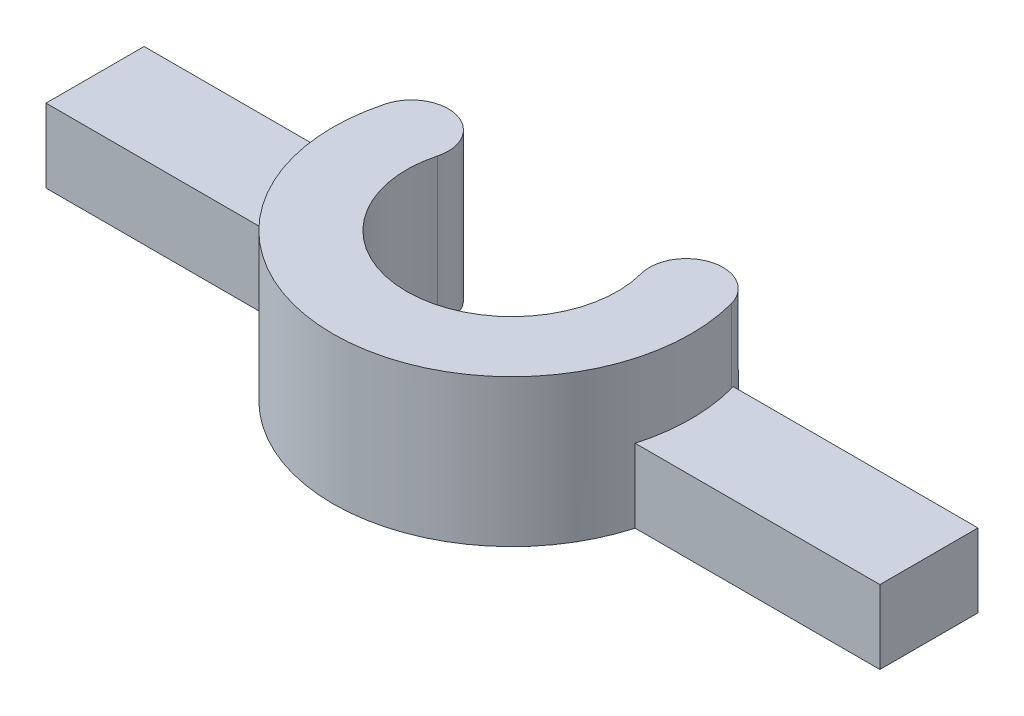
ISO-10303-21;
HEADER;
FILE_DESCRIPTION(('STEP AP214'),'2;1');
FILE_NAME('part.step','',(''),(''),'','','');
FILE_SCHEMA(('AUTOMOTIVE_DESIGN { 1 0 10303 214 1 1 1 1 }'));
ENDSEC;
DATA;
#1=APPLICATION_CONTEXT('core data for automotive mechanical design processes');
#2=APPLICATION_PROTOCOL_DEFINITION('international standard','automotive_design',2000,#1);
#3=PRODUCT_CONTEXT('',#1,'mechanical');
#4=PRODUCT('Part','Part','',(#3));
#5=PRODUCT_RELATED_PRODUCT_CATEGORY('part','',(#4));
#6=PRODUCT_DEFINITION_FORMATION('','',#4);
#7=PRODUCT_DEFINITION_CONTEXT('part definition',#1,'design');
#8=PRODUCT_DEFINITION('design','',#6,#7);
#9=PRODUCT_DEFINITION_SHAPE('','',#8);
#10=(LENGTH_UNIT() NAMED_UNIT(*) SI_UNIT(.MILLI.,.METRE.));
#11=(NAMED_UNIT(*) PLANE_ANGLE_UNIT() SI_UNIT($,.RADIAN.));
#12=(NAMED_UNIT(*) SI_UNIT($,.STERADIAN.) SOLID_ANGLE_UNIT());
#13=UNCERTAINTY_MEASURE_WITH_UNIT(LENGTH_MEASURE(1.E-05),#10,'distance_accuracy_value','');
#14=(GEOMETRIC_REPRESENTATION_CONTEXT(3) GLOBAL_UNCERTAINTY_ASSIGNED_CONTEXT((#13)) GLOBAL_UNIT_ASSIGNED_CONTEXT((#10,
#11,#12)) REPRESENTATION_CONTEXT('',''));
#15=CARTESIAN_POINT('',(0.,0.,0.));
#16=DIRECTION('',(0.,0.,1.));
#17=DIRECTION('',(1.,0.,0.));
#18=AXIS2_PLACEMENT_3D('',#15,#16,#17);
#19=CARTESIAN_POINT('',(0.,68.,0.));
#20=DIRECTION('',(0.,-1.,0.));
#21=DIRECTION('',(0.,0.,-1.));
#22=AXIS2_PLACEMENT_3D('',#19,#20,#21);
#23=CYLINDRICAL_SURFACE('',#22,7.3);
#24=CARTESIAN_POINT('',(0.,62.,0.));
#25=DIRECTION('',(0.,-1.,0.));
#26=DIRECTION('',(0.,0.,-1.));
#27=AXIS2_PLACEMENT_3D('',#24,#25,#26);
#28=CIRCLE('',#27,7.3);
#29=CARTESIAN_POINT('',(7.0206837273873,62.,2.));
#30=VERTEX_POINT('',#29);
#31=CARTESIAN_POINT('',(-7.02068372738718,62.,2.));
#32=VERTEX_POINT('',#31);
#33=EDGE_CURVE('E186',#30,#32,#28,.T.);
#34=ORIENTED_EDGE('',*,*,#33,.F.);
#35=DIRECTION('',(0.,-1.,0.));
#36=VECTOR('',#35,1.);
#37=CARTESIAN_POINT('',(7.0206837273873,68.,2.));
#38=LINE('',#37,#36);
#39=CARTESIAN_POINT('',(7.0206837273873,65.,2.));
#40=VERTEX_POINT('',#39);
#41=EDGE_CURVE('E148',#40,#30,#38,.T.);
#42=ORIENTED_EDGE('',*,*,#41,.F.);
#43=CARTESIAN_POINT('',(0.,65.,0.));
#44=DIRECTION('',(0.,-1.,0.));
#45=DIRECTION('',(1.,0.,0.));
#46=AXIS2_PLACEMENT_3D('',#43,#44,#45);
#47=CIRCLE('',#46,7.3);
#48=CARTESIAN_POINT('',(7.05087040488933,65.,-1.89082694434383));
#49=VERTEX_POINT('',#48);
#50=EDGE_CURVE('E200',#40,#49,#47,.F.);
#51=ORIENTED_EDGE('',*,*,#50,.T.);
#52=DIRECTION('',(0.,-1.,0.));
#53=VECTOR('',#52,1.);
#54=CARTESIAN_POINT('',(7.05087040488933,68.,-1.89082694434383));
#55=LINE('',#54,#53);
#56=CARTESIAN_POINT('',(7.05087040488933,68.,-1.89082694434383));
#57=VERTEX_POINT('',#56);
#58=EDGE_CURVE('E216',#49,#57,#55,.F.);
#59=ORIENTED_EDGE('',*,*,#58,.T.);
#60=CARTESIAN_POINT('',(0.,68.,0.));
#61=DIRECTION('',(0.,1.,0.));
#62=DIRECTION('',(0.,0.,1.));
#63=AXIS2_PLACEMENT_3D('',#60,#61,#62);
#64=CIRCLE('',#63,7.3);
#65=CARTESIAN_POINT('',(-7.05087040488921,68.,-1.89082694434383));
#66=VERTEX_POINT('',#65);
#67=EDGE_CURVE('E197',#66,#57,#64,.T.);
#68=ORIENTED_EDGE('',*,*,#67,.F.);
#69=DIRECTION('',(0.,-1.,0.));
#70=VECTOR('',#69,1.);
#71=CARTESIAN_POINT('',(-7.05087040488921,68.,-1.89082694434383));
#72=LINE('',#71,#70);
#73=CARTESIAN_POINT('',(-7.05087040488921,65.,-1.89082694434383));
#74=VERTEX_POINT('',#73);
#75=EDGE_CURVE('E241',#66,#74,#72,.T.);
#76=ORIENTED_EDGE('',*,*,#75,.T.);
#77=CARTESIAN_POINT('',(-7.02068372738718,65.,2.));
#78=VERTEX_POINT('',#77);
#79=EDGE_CURVE('E203',#74,#78,#47,.F.);
#80=ORIENTED_EDGE('',*,*,#79,.T.);
#81=DIRECTION('',(0.,-1.,0.));
#82=VECTOR('',#81,1.);
#83=CARTESIAN_POINT('',(-7.02068372738718,68.,2.));
#84=LINE('',#83,#82);
#85=EDGE_CURVE('E213',#32,#78,#84,.F.);
#86=ORIENTED_EDGE('',*,*,#85,.F.);
#87=EDGE_LOOP('',(#34,#42,#51,#59,#68,#76,#80,#86));
#88=FACE_BOUND('',#87,.T.);
#89=ADVANCED_FACE('F40',(#88),#23,.T.);
#90=CARTESIAN_POINT('',(0.,68.,0.));
#91=DIRECTION('',(0.,-1.,0.));
#92=DIRECTION('',(0.,0.,-1.));
#93=AXIS2_PLACEMENT_3D('',#90,#91,#92);
#94=CYLINDRICAL_SURFACE('',#93,4.3);
#95=DIRECTION('',(0.,-1.,0.));
#96=VECTOR('',#95,1.);
#97=CARTESIAN_POINT('',(4.1532524302773,68.,-1.1137747754354));
#98=LINE('',#97,#96);
#99=CARTESIAN_POINT('',(4.1532524302773,68.,-1.1137747754354));
#100=VERTEX_POINT('',#99);
#101=CARTESIAN_POINT('',(4.1532524302773,62.,-1.1137747754354));
#102=VERTEX_POINT('',#101);
#103=EDGE_CURVE('E225',#100,#102,#98,.T.);
#104=ORIENTED_EDGE('',*,*,#103,.T.);
#105=CARTESIAN_POINT('',(0.,62.,0.));
#106=DIRECTION('',(0.,-1.,0.));
#107=DIRECTION('',(0.,0.,-1.));
#108=AXIS2_PLACEMENT_3D('',#105,#106,#107);
#109=CIRCLE('',#108,4.3);
#110=CARTESIAN_POINT('',(-4.15325243027718,62.,-1.1137747754354));
#111=VERTEX_POINT('',#110);
#112=EDGE_CURVE('E183',#102,#111,#109,.T.);
#113=ORIENTED_EDGE('',*,*,#112,.T.);
#114=DIRECTION('',(0.,-1.,0.));
#115=VECTOR('',#114,1.);
#116=CARTESIAN_POINT('',(-4.15325243027718,68.,-1.1137747754354));
#117=LINE('',#116,#115);
#118=CARTESIAN_POINT('',(-4.15325243027718,68.,-1.1137747754354));
#119=VERTEX_POINT('',#118);
#120=EDGE_CURVE('E233',#111,#119,#117,.F.);
#121=ORIENTED_EDGE('',*,*,#120,.T.);
#122=CARTESIAN_POINT('',(0.,68.,0.));
#123=DIRECTION('',(0.,1.,0.));
#124=DIRECTION('',(0.,0.,1.));
#125=AXIS2_PLACEMENT_3D('',#122,#123,#124);
#126=CIRCLE('',#125,4.3);
#127=EDGE_CURVE('E195',#119,#100,#126,.T.);
#128=ORIENTED_EDGE('',*,*,#127,.T.);
#129=EDGE_LOOP('',(#104,#113,#121,#128));
#130=FACE_BOUND('',#129,.T.);
#131=ADVANCED_FACE('F280',(#130),#94,.F.);
#132=CARTESIAN_POINT('',(0.,0.,-2.));
#133=DIRECTION('',(0.,0.,1.));
#134=DIRECTION('',(1.,0.,0.));
#135=AXIS2_PLACEMENT_3D('',#132,#133,#134);
#136=PLANE('',#135);
#137=DIRECTION('',(1.,0.,0.));
#138=VECTOR('',#137,1.);
#139=CARTESIAN_POINT('',(0.,62.,-2.));
#140=LINE('',#139,#138);
#141=CARTESIAN_POINT('',(-17.,62.,-2.));
#142=VERTEX_POINT('',#141);
#143=CARTESIAN_POINT('',(-7.01708635232229,62.,-2.));
#144=VERTEX_POINT('',#143);
#145=EDGE_CURVE('E210',#142,#144,#140,.T.);
#146=ORIENTED_EDGE('',*,*,#145,.F.);
#147=DIRECTION('',(0.,-1.,0.));
#148=VECTOR('',#147,1.);
#149=CARTESIAN_POINT('',(-17.,65.,-2.));
#150=LINE('',#149,#148);
#151=CARTESIAN_POINT('',(-17.,65.,-2.));
#152=VERTEX_POINT('',#151);
#153=EDGE_CURVE('E176',#152,#142,#150,.T.);
#154=ORIENTED_EDGE('',*,*,#153,.F.);
#155=DIRECTION('',(1.,0.,0.));
#156=VECTOR('',#155,1.);
#157=CARTESIAN_POINT('',(0.,65.,-2.));
#158=LINE('',#157,#156);
#159=CARTESIAN_POINT('',(-7.01708635232229,65.,-2.));
#160=VERTEX_POINT('',#159);
#161=EDGE_CURVE('E62',#152,#160,#158,.T.);
#162=ORIENTED_EDGE('',*,*,#161,.T.);
#163=DIRECTION('',(0.,-1.,0.));
#164=VECTOR('',#163,1.);
#165=CARTESIAN_POINT('',(-7.01708635232229,65.,-2.));
#166=LINE('',#165,#164);
#167=EDGE_CURVE('E48',#160,#144,#166,.T.);
#168=ORIENTED_EDGE('',*,*,#167,.T.);
#169=EDGE_LOOP('',(#146,#154,#162,#168));
#170=FACE_BOUND('',#169,.T.);
#171=ADVANCED_FACE('F285',(#170),#136,.F.);
#172=CARTESIAN_POINT('',(7.01708635232241,65.,-2.));
#173=VERTEX_POINT('',#172);
#174=CARTESIAN_POINT('',(17.,65.,-2.));
#175=VERTEX_POINT('',#174);
#176=EDGE_CURVE('E208',#173,#175,#158,.T.);
#177=ORIENTED_EDGE('',*,*,#176,.T.);
#178=DIRECTION('',(0.,-1.,0.));
#179=VECTOR('',#178,1.);
#180=CARTESIAN_POINT('',(17.,65.,-2.));
#181=LINE('',#180,#179);
#182=CARTESIAN_POINT('',(17.,62.,-2.));
#183=VERTEX_POINT('',#182);
#184=EDGE_CURVE('E165',#175,#183,#181,.T.);
#185=ORIENTED_EDGE('',*,*,#184,.T.);
#186=CARTESIAN_POINT('',(7.01708635232241,62.,-2.));
#187=VERTEX_POINT('',#186);
#188=EDGE_CURVE('E164',#187,#183,#140,.T.);
#189=ORIENTED_EDGE('',*,*,#188,.F.);
#190=DIRECTION('',(0.,-1.,0.));
#191=VECTOR('',#190,1.);
#192=CARTESIAN_POINT('',(7.01708635232241,62.,-2.));
#193=LINE('',#192,#191);
#194=EDGE_CURVE('E228',#187,#173,#193,.F.);
#195=ORIENTED_EDGE('',*,*,#194,.T.);
#196=EDGE_LOOP('',(#177,#185,#189,#195));
#197=FACE_BOUND('',#196,.T.);
#198=ADVANCED_FACE('F282',(#197),#136,.F.);
#199=CARTESIAN_POINT('',(0.,0.,2.));
#200=DIRECTION('',(0.,0.,1.));
#201=DIRECTION('',(1.,0.,0.));
#202=AXIS2_PLACEMENT_3D('',#199,#200,#201);
#203=PLANE('',#202);
#204=DIRECTION('',(1.,0.,0.));
#205=VECTOR('',#204,1.);
#206=CARTESIAN_POINT('',(0.,65.,2.));
#207=LINE('',#206,#205);
#208=CARTESIAN_POINT('',(-17.,65.,2.));
#209=VERTEX_POINT('',#208);
#210=EDGE_CURVE('E151',#209,#78,#207,.T.);
#211=ORIENTED_EDGE('',*,*,#210,.F.);
#212=DIRECTION('',(0.,1.,0.));
#213=VECTOR('',#212,1.);
#214=CARTESIAN_POINT('',(-17.,65.,2.));
#215=LINE('',#214,#213);
#216=CARTESIAN_POINT('',(-17.,62.,2.));
#217=VERTEX_POINT('',#216);
#218=EDGE_CURVE('E170',#217,#209,#215,.T.);
#219=ORIENTED_EDGE('',*,*,#218,.F.);
#220=DIRECTION('',(1.,0.,0.));
#221=VECTOR('',#220,1.);
#222=CARTESIAN_POINT('',(0.,62.,2.));
#223=LINE('',#222,#221);
#224=EDGE_CURVE('E150',#217,#32,#223,.T.);
#225=ORIENTED_EDGE('',*,*,#224,.T.);
#226=ORIENTED_EDGE('',*,*,#85,.T.);
#227=EDGE_LOOP('',(#211,#219,#225,#226));
#228=FACE_BOUND('',#227,.T.);
#229=ADVANCED_FACE('F284',(#228),#203,.T.);
#230=CARTESIAN_POINT('',(17.,62.,2.));
#231=VERTEX_POINT('',#230);
#232=EDGE_CURVE('E142',#30,#231,#223,.T.);
#233=ORIENTED_EDGE('',*,*,#232,.T.);
#234=DIRECTION('',(0.,1.,0.));
#235=VECTOR('',#234,1.);
#236=CARTESIAN_POINT('',(17.,65.,2.));
#237=LINE('',#236,#235);
#238=CARTESIAN_POINT('',(17.,65.,2.));
#239=VERTEX_POINT('',#238);
#240=EDGE_CURVE('E146',#231,#239,#237,.T.);
#241=ORIENTED_EDGE('',*,*,#240,.T.);
#242=EDGE_CURVE('E205',#40,#239,#207,.T.);
#243=ORIENTED_EDGE('',*,*,#242,.F.);
#244=ORIENTED_EDGE('',*,*,#41,.T.);
#245=EDGE_LOOP('',(#233,#241,#243,#244));
#246=FACE_BOUND('',#245,.T.);
#247=ADVANCED_FACE('F144',(#246),#203,.T.);
#248=CARTESIAN_POINT('',(5.60206141758332,68.,-1.50230085988962));
#249=DIRECTION('',(0.,-1.,0.));
#250=DIRECTION('',(0.,0.,-1.));
#251=AXIS2_PLACEMENT_3D('',#248,#249,#250);
#252=CYLINDRICAL_SURFACE('',#251,1.5);
#253=DIRECTION('',(0.,1.,0.));
#254=VECTOR('',#253,1.);
#255=CARTESIAN_POINT('',(4.85206141758332,68.,-2.80133896556628));
#256=LINE('',#255,#254);
#257=CARTESIAN_POINT('',(4.85206141758332,62.,-2.80133896556628));
#258=VERTEX_POINT('',#257);
#259=CARTESIAN_POINT('',(4.85206141758332,68.,-2.80133896556627));
#260=VERTEX_POINT('',#259);
#261=EDGE_CURVE('E198',#258,#260,#256,.T.);
#262=ORIENTED_EDGE('',*,*,#261,.F.);
#263=CARTESIAN_POINT('',(5.60206141758332,62.,-1.50230085988962));
#264=DIRECTION('',(0.,-1.,0.));
#265=DIRECTION('',(0.,0.,-1.));
#266=AXIS2_PLACEMENT_3D('',#263,#264,#265);
#267=CIRCLE('',#266,1.5);
#268=EDGE_CURVE('E188',#258,#102,#267,.F.);
#269=ORIENTED_EDGE('',*,*,#268,.T.);
#270=ORIENTED_EDGE('',*,*,#103,.F.);
#271=CARTESIAN_POINT('',(5.60206141758332,68.,-1.50230085988962));
#272=DIRECTION('',(0.,1.,0.));
#273=DIRECTION('',(0.,0.,1.));
#274=AXIS2_PLACEMENT_3D('',#271,#272,#273);
#275=CIRCLE('',#274,1.5);
#276=EDGE_CURVE('E219',#260,#100,#275,.T.);
#277=ORIENTED_EDGE('',*,*,#276,.F.);
#278=EDGE_LOOP('',(#262,#269,#270,#277));
#279=FACE_BOUND('',#278,.T.);
#280=ADVANCED_FACE('F278',(#279),#252,.T.);
#281=CARTESIAN_POINT('',(5.60206141758332,68.,-1.50230085988962));
#282=DIRECTION('',(0.,-1.,0.));
#283=DIRECTION('',(0.,0.,-1.));
#284=AXIS2_PLACEMENT_3D('',#281,#282,#283);
#285=CYLINDRICAL_SURFACE('',#284,1.5);
#286=ORIENTED_EDGE('',*,*,#194,.F.);
#287=CARTESIAN_POINT('',(5.60206141758332,62.,-1.50230085988962));
#288=DIRECTION('',(0.,-1.,0.));
#289=DIRECTION('',(0.,0.,-1.));
#290=AXIS2_PLACEMENT_3D('',#287,#288,#289);
#291=CIRCLE('',#290,1.5);
#292=EDGE_CURVE('E189',#187,#258,#291,.F.);
#293=ORIENTED_EDGE('',*,*,#292,.T.);
#294=ORIENTED_EDGE('',*,*,#261,.T.);
#295=CARTESIAN_POINT('',(5.60206141758332,68.,-1.50230085988962));
#296=DIRECTION('',(0.,1.,0.));
#297=DIRECTION('',(0.,0.,1.));
#298=AXIS2_PLACEMENT_3D('',#295,#296,#297);
#299=CIRCLE('',#298,1.5);
#300=EDGE_CURVE('E222',#57,#260,#299,.T.);
#301=ORIENTED_EDGE('',*,*,#300,.F.);
#302=ORIENTED_EDGE('',*,*,#58,.F.);
#303=CARTESIAN_POINT('',(5.60206141758332,65.,-1.50230085988962));
#304=DIRECTION('',(0.,-1.,0.));
#305=DIRECTION('',(1.,0.,0.));
#306=AXIS2_PLACEMENT_3D('',#303,#304,#305);
#307=CIRCLE('',#306,1.5);
#308=EDGE_CURVE('E231',#173,#49,#307,.T.);
#309=ORIENTED_EDGE('',*,*,#308,.F.);
#310=EDGE_LOOP('',(#286,#293,#294,#301,#302,#309));
#311=FACE_BOUND('',#310,.T.);
#312=ADVANCED_FACE('F273',(#311),#285,.T.);
#313=CARTESIAN_POINT('',(-5.60206141758319,68.,-1.50230085988962));
#314=DIRECTION('',(0.,-1.,0.));
#315=DIRECTION('',(0.,0.,-1.));
#316=AXIS2_PLACEMENT_3D('',#313,#314,#315);
#317=CYLINDRICAL_SURFACE('',#316,1.5);
#318=DIRECTION('',(0.,1.,0.));
#319=VECTOR('',#318,1.);
#320=CARTESIAN_POINT('',(-4.8520614175832,68.,-2.80133896556627));
#321=LINE('',#320,#319);
#322=CARTESIAN_POINT('',(-4.8520614175832,62.,-2.80133896556627));
#323=VERTEX_POINT('',#322);
#324=CARTESIAN_POINT('',(-4.8520614175832,68.,-2.80133896556627));
#325=VERTEX_POINT('',#324);
#326=EDGE_CURVE('E192',#323,#325,#321,.T.);
#327=ORIENTED_EDGE('',*,*,#326,.F.);
#328=CARTESIAN_POINT('',(-5.60206141758319,62.,-1.50230085988962));
#329=DIRECTION('',(0.,-1.,0.));
#330=DIRECTION('',(0.,0.,-1.));
#331=AXIS2_PLACEMENT_3D('',#328,#329,#330);
#332=CIRCLE('',#331,1.5);
#333=EDGE_CURVE('E55',#323,#144,#332,.F.);
#334=ORIENTED_EDGE('',*,*,#333,.T.);
#335=ORIENTED_EDGE('',*,*,#167,.F.);
#336=CARTESIAN_POINT('',(-5.60206141758319,65.,-1.50230085988962));
#337=DIRECTION('',(0.,-1.,0.));
#338=DIRECTION('',(1.,0.,0.));
#339=AXIS2_PLACEMENT_3D('',#336,#337,#338);
#340=CIRCLE('',#339,1.5);
#341=EDGE_CURVE('E243',#74,#160,#340,.T.);
#342=ORIENTED_EDGE('',*,*,#341,.F.);
#343=ORIENTED_EDGE('',*,*,#75,.F.);
#344=CARTESIAN_POINT('',(-5.60206141758319,68.,-1.50230085988962));
#345=DIRECTION('',(0.,1.,0.));
#346=DIRECTION('',(0.,0.,1.));
#347=AXIS2_PLACEMENT_3D('',#344,#345,#346);
#348=CIRCLE('',#347,1.5);
#349=EDGE_CURVE('E236',#325,#66,#348,.T.);
#350=ORIENTED_EDGE('',*,*,#349,.F.);
#351=EDGE_LOOP('',(#327,#334,#335,#342,#343,#350));
#352=FACE_BOUND('',#351,.T.);
#353=ADVANCED_FACE('F42',(#352),#317,.T.);
#354=CARTESIAN_POINT('',(-5.60206141758319,68.,-1.50230085988962));
#355=DIRECTION('',(0.,-1.,0.));
#356=DIRECTION('',(0.,0.,-1.));
#357=AXIS2_PLACEMENT_3D('',#354,#355,#356);
#358=CYLINDRICAL_SURFACE('',#357,1.5);
#359=ORIENTED_EDGE('',*,*,#120,.F.);
#360=CARTESIAN_POINT('',(-5.60206141758319,62.,-1.50230085988962));
#361=DIRECTION('',(0.,-1.,0.));
#362=DIRECTION('',(0.,0.,-1.));
#363=AXIS2_PLACEMENT_3D('',#360,#361,#362);
#364=CIRCLE('',#363,1.5);
#365=EDGE_CURVE('E11',#111,#323,#364,.F.);
#366=ORIENTED_EDGE('',*,*,#365,.T.);
#367=ORIENTED_EDGE('',*,*,#326,.T.);
#368=CARTESIAN_POINT('',(-5.60206141758319,68.,-1.50230085988962));
#369=DIRECTION('',(0.,1.,0.));
#370=DIRECTION('',(0.,0.,1.));
#371=AXIS2_PLACEMENT_3D('',#368,#369,#370);
#372=CIRCLE('',#371,1.5);
#373=EDGE_CURVE('E238',#119,#325,#372,.T.);
#374=ORIENTED_EDGE('',*,*,#373,.F.);
#375=EDGE_LOOP('',(#359,#366,#367,#374));
#376=FACE_BOUND('',#375,.T.);
#377=ADVANCED_FACE('F249',(#376),#358,.T.);
#378=CARTESIAN_POINT('',(0.,68.,0.));
#379=DIRECTION('',(0.,1.,0.));
#380=DIRECTION('',(0.,0.,1.));
#381=AXIS2_PLACEMENT_3D('',#378,#379,#380);
#382=PLANE('',#381);
#383=ORIENTED_EDGE('',*,*,#127,.F.);
#384=ORIENTED_EDGE('',*,*,#373,.T.);
#385=ORIENTED_EDGE('',*,*,#349,.T.);
#386=ORIENTED_EDGE('',*,*,#67,.T.);
#387=ORIENTED_EDGE('',*,*,#300,.T.);
#388=ORIENTED_EDGE('',*,*,#276,.T.);
#389=EDGE_LOOP('',(#383,#384,#385,#386,#387,#388));
#390=FACE_BOUND('',#389,.T.);
#391=ADVANCED_FACE('F254',(#390),#382,.T.);
#392=CARTESIAN_POINT('',(0.,65.,-2.));
#393=DIRECTION('',(0.,-1.,0.));
#394=DIRECTION('',(1.,0.,0.));
#395=AXIS2_PLACEMENT_3D('',#392,#393,#394);
#396=PLANE('',#395);
#397=ORIENTED_EDGE('',*,*,#79,.F.);
#398=ORIENTED_EDGE('',*,*,#341,.T.);
#399=ORIENTED_EDGE('',*,*,#161,.F.);
#400=DIRECTION('',(0.,0.,-1.));
#401=VECTOR('',#400,1.);
#402=CARTESIAN_POINT('',(-17.,65.,2.));
#403=LINE('',#402,#401);
#404=EDGE_CURVE('E173',#209,#152,#403,.T.);
#405=ORIENTED_EDGE('',*,*,#404,.F.);
#406=ORIENTED_EDGE('',*,*,#210,.T.);
#407=EDGE_LOOP('',(#397,#398,#399,#405,#406));
#408=FACE_BOUND('',#407,.T.);
#409=ADVANCED_FACE('F263',(#408),#396,.F.);
#410=CARTESIAN_POINT('',(0.,62.,-2.));
#411=DIRECTION('',(0.,-1.,0.));
#412=DIRECTION('',(0.,0.,-1.));
#413=AXIS2_PLACEMENT_3D('',#410,#411,#412);
#414=PLANE('',#413);
#415=ORIENTED_EDGE('',*,*,#33,.T.);
#416=ORIENTED_EDGE('',*,*,#224,.F.);
#417=DIRECTION('',(0.,0.,1.));
#418=VECTOR('',#417,1.);
#419=CARTESIAN_POINT('',(-17.,62.,2.));
#420=LINE('',#419,#418);
#421=EDGE_CURVE('E179',#142,#217,#420,.T.);
#422=ORIENTED_EDGE('',*,*,#421,.F.);
#423=ORIENTED_EDGE('',*,*,#145,.T.);
#424=ORIENTED_EDGE('',*,*,#333,.F.);
#425=ORIENTED_EDGE('',*,*,#365,.F.);
#426=ORIENTED_EDGE('',*,*,#112,.F.);
#427=ORIENTED_EDGE('',*,*,#268,.F.);
#428=ORIENTED_EDGE('',*,*,#292,.F.);
#429=ORIENTED_EDGE('',*,*,#188,.T.);
#430=DIRECTION('',(0.,0.,1.));
#431=VECTOR('',#430,1.);
#432=CARTESIAN_POINT('',(17.,62.,2.));
#433=LINE('',#432,#431);
#434=EDGE_CURVE('E157',#183,#231,#433,.T.);
#435=ORIENTED_EDGE('',*,*,#434,.T.);
#436=ORIENTED_EDGE('',*,*,#232,.F.);
#437=EDGE_LOOP('',(#415,#416,#422,#423,#424,#425,#426,#427,#428,#429,#435,#436));
#438=FACE_BOUND('',#437,.T.);
#439=ADVANCED_FACE('F162',(#438),#414,.T.);
#440=ORIENTED_EDGE('',*,*,#50,.F.);
#441=ORIENTED_EDGE('',*,*,#242,.T.);
#442=DIRECTION('',(0.,0.,-1.));
#443=VECTOR('',#442,1.);
#444=CARTESIAN_POINT('',(17.,65.,2.));
#445=LINE('',#444,#443);
#446=EDGE_CURVE('E160',#239,#175,#445,.T.);
#447=ORIENTED_EDGE('',*,*,#446,.T.);
#448=ORIENTED_EDGE('',*,*,#176,.F.);
#449=ORIENTED_EDGE('',*,*,#308,.T.);
#450=EDGE_LOOP('',(#440,#441,#447,#448,#449));
#451=FACE_BOUND('',#450,.T.);
#452=ADVANCED_FACE('F267',(#451),#396,.F.);
#453=CARTESIAN_POINT('',(-17.,0.,0.));
#454=DIRECTION('',(1.,0.,0.));
#455=DIRECTION('',(0.,0.,-1.));
#456=AXIS2_PLACEMENT_3D('',#453,#454,#455);
#457=PLANE('',#456);
#458=ORIENTED_EDGE('',*,*,#218,.T.);
#459=ORIENTED_EDGE('',*,*,#404,.T.);
#460=ORIENTED_EDGE('',*,*,#153,.T.);
#461=ORIENTED_EDGE('',*,*,#421,.T.);
#462=EDGE_LOOP('',(#458,#459,#460,#461));
#463=FACE_BOUND('',#462,.T.);
#464=ADVANCED_FACE('F303',(#463),#457,.F.);
#465=CARTESIAN_POINT('',(17.,0.,0.));
#466=DIRECTION('',(-1.,0.,0.));
#467=DIRECTION('',(0.,0.,-1.));
#468=AXIS2_PLACEMENT_3D('',#465,#466,#467);
#469=PLANE('',#468);
#470=ORIENTED_EDGE('',*,*,#240,.F.);
#471=ORIENTED_EDGE('',*,*,#434,.F.);
#472=ORIENTED_EDGE('',*,*,#184,.F.);
#473=ORIENTED_EDGE('',*,*,#446,.F.);
#474=EDGE_LOOP('',(#470,#471,#472,#473));
#475=FACE_BOUND('',#474,.T.);
#476=ADVANCED_FACE('F155',(#475),#469,.F.);
#477=CLOSED_SHELL('',(#89,#131,#171,#198,#229,#247,#280,#312,#353,#377,#391,#409,#439,#452,#464,#476));
#478=MANIFOLD_SOLID_BREP('B2',#477);
#479=ADVANCED_BREP_SHAPE_REPRESENTATION('',(#18,#478),#14);
#480=SHAPE_DEFINITION_REPRESENTATION(#9,#479);
ENDSEC;
END-ISO-10303-21;
